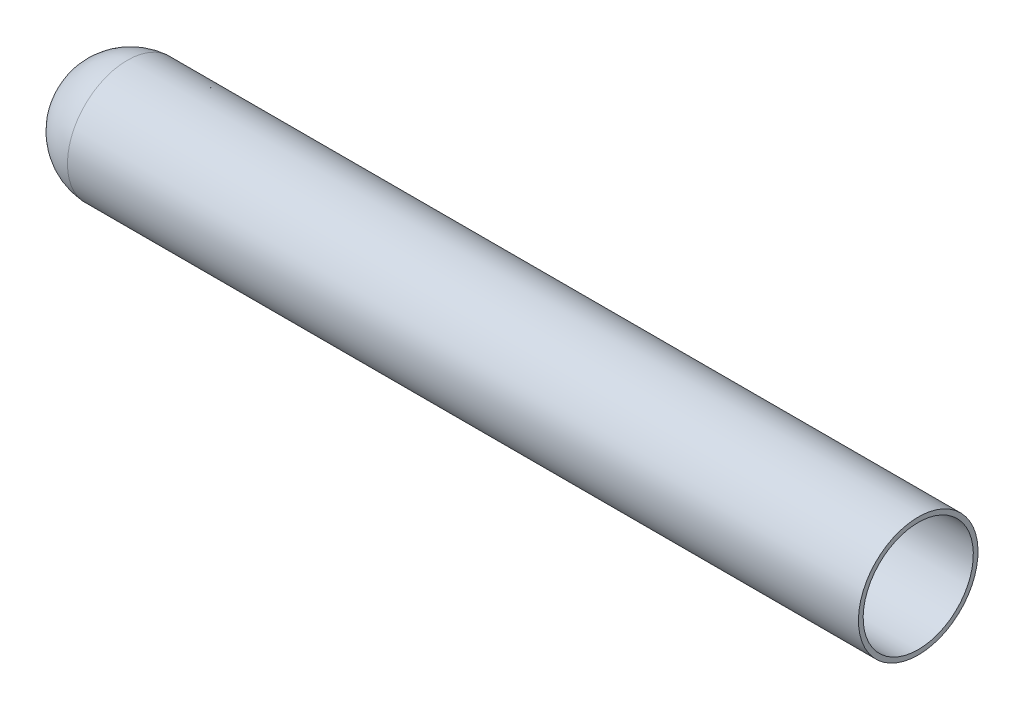
ISO-10303-21;
HEADER;
FILE_DESCRIPTION(('STEP AP214'),'2;1');
FILE_NAME('part.step','',(''),(''),'','','');
FILE_SCHEMA(('AUTOMOTIVE_DESIGN { 1 0 10303 214 1 1 1 1 }'));
ENDSEC;
DATA;
#1=APPLICATION_CONTEXT('core data for automotive mechanical design processes');
#2=APPLICATION_PROTOCOL_DEFINITION('international standard','automotive_design',2000,#1);
#3=PRODUCT_CONTEXT('',#1,'mechanical');
#4=PRODUCT('Part','Part','',(#3));
#5=PRODUCT_RELATED_PRODUCT_CATEGORY('part','',(#4));
#6=PRODUCT_DEFINITION_FORMATION('','',#4);
#7=PRODUCT_DEFINITION_CONTEXT('part definition',#1,'design');
#8=PRODUCT_DEFINITION('design','',#6,#7);
#9=PRODUCT_DEFINITION_SHAPE('','',#8);
#10=(LENGTH_UNIT() NAMED_UNIT(*) SI_UNIT(.MILLI.,.METRE.));
#11=(NAMED_UNIT(*) PLANE_ANGLE_UNIT() SI_UNIT($,.RADIAN.));
#12=(NAMED_UNIT(*) SI_UNIT($,.STERADIAN.) SOLID_ANGLE_UNIT());
#13=UNCERTAINTY_MEASURE_WITH_UNIT(LENGTH_MEASURE(1.E-05),#10,'distance_accuracy_value','');
#14=(GEOMETRIC_REPRESENTATION_CONTEXT(3) GLOBAL_UNCERTAINTY_ASSIGNED_CONTEXT((#13)) GLOBAL_UNIT_ASSIGNED_CONTEXT((#10,
#11,#12)) REPRESENTATION_CONTEXT('',''));
#15=CARTESIAN_POINT('',(0.,0.,0.));
#16=DIRECTION('',(0.,0.,1.));
#17=DIRECTION('',(1.,0.,0.));
#18=AXIS2_PLACEMENT_3D('',#15,#16,#17);
#19=CARTESIAN_POINT('',(3.18010416666666,0.,0.));
#20=DIRECTION('',(-1.,0.,0.));
#21=DIRECTION('',(0.,1.,0.));
#22=AXIS2_PLACEMENT_3D('',#19,#20,#21);
#23=SPHERICAL_SURFACE('',#22,3.18010416666666);
#24=CARTESIAN_POINT('',(3.,0.,0.));
#25=DIRECTION('',(-1.,0.,0.));
#26=DIRECTION('',(0.,-1.,0.));
#27=AXIS2_PLACEMENT_3D('',#24,#25,#26);
#28=CIRCLE('',#27,3.17499999999999);
#29=CARTESIAN_POINT('',(3.,-3.17499999999999,0.));
#30=VERTEX_POINT('',#29);
#31=EDGE_CURVE('E54',#30,#30,#28,.T.);
#32=ORIENTED_EDGE('',*,*,#31,.T.);
#33=EDGE_LOOP('',(#32));
#34=FACE_BOUND('',#33,.T.);
#35=ADVANCED_FACE('F37',(#34),#23,.T.);
#36=CARTESIAN_POINT('',(3.18010416666666,0.,0.));
#37=DIRECTION('',(-1.,0.,0.));
#38=DIRECTION('',(0.,1.,0.));
#39=AXIS2_PLACEMENT_3D('',#36,#37,#38);
#40=SPHERICAL_SURFACE('',#39,2.93010416666666);
#41=CARTESIAN_POINT('',(3.0072301445657,0.,0.));
#42=DIRECTION('',(-1.,0.,0.));
#43=DIRECTION('',(0.,-1.,0.));
#44=AXIS2_PLACEMENT_3D('',#41,#42,#43);
#45=CIRCLE('',#44,2.92499999999999);
#46=CARTESIAN_POINT('',(3.0072301445657,-2.92499999999999,0.));
#47=VERTEX_POINT('',#46);
#48=EDGE_CURVE('E10',#47,#47,#45,.T.);
#49=ORIENTED_EDGE('',*,*,#48,.F.);
#50=EDGE_LOOP('',(#49));
#51=FACE_BOUND('',#50,.T.);
#52=ADVANCED_FACE('F75',(#51),#40,.F.);
#53=CARTESIAN_POINT('',(0.25,0.,0.));
#54=DIRECTION('',(-1.,0.,0.));
#55=DIRECTION('',(0.,-1.,0.));
#56=AXIS2_PLACEMENT_3D('',#53,#54,#55);
#57=CYLINDRICAL_SURFACE('',#56,2.925);
#58=CARTESIAN_POINT('',(45.,0.,0.));
#59=DIRECTION('',(-1.,0.,0.));
#60=DIRECTION('',(0.,-1.,0.));
#61=AXIS2_PLACEMENT_3D('',#58,#59,#60);
#62=CIRCLE('',#61,2.925);
#63=CARTESIAN_POINT('',(45.,-2.925,0.));
#64=VERTEX_POINT('',#63);
#65=EDGE_CURVE('E44',#64,#64,#62,.T.);
#66=ORIENTED_EDGE('',*,*,#65,.F.);
#67=EDGE_LOOP('',(#66));
#68=FACE_BOUND('',#67,.T.);
#69=ORIENTED_EDGE('',*,*,#48,.T.);
#70=EDGE_LOOP('',(#69));
#71=FACE_BOUND('',#70,.T.);
#72=ADVANCED_FACE('F70',(#68,#71),#57,.F.);
#73=CARTESIAN_POINT('',(45.,2.925,0.));
#74=DIRECTION('',(-1.,0.,0.));
#75=DIRECTION('',(0.,-1.,0.));
#76=AXIS2_PLACEMENT_3D('',#73,#74,#75);
#77=PLANE('',#76);
#78=CARTESIAN_POINT('',(45.,0.,0.));
#79=DIRECTION('',(-1.,0.,0.));
#80=DIRECTION('',(0.,-1.,0.));
#81=AXIS2_PLACEMENT_3D('',#78,#79,#80);
#82=CIRCLE('',#81,3.175);
#83=CARTESIAN_POINT('',(45.,-3.175,0.));
#84=VERTEX_POINT('',#83);
#85=EDGE_CURVE('E49',#84,#84,#82,.T.);
#86=ORIENTED_EDGE('',*,*,#85,.F.);
#87=EDGE_LOOP('',(#86));
#88=FACE_BOUND('',#87,.T.);
#89=ORIENTED_EDGE('',*,*,#65,.T.);
#90=EDGE_LOOP('',(#89));
#91=FACE_BOUND('',#90,.T.);
#92=ADVANCED_FACE('F65',(#88,#91),#77,.F.);
#93=CARTESIAN_POINT('',(0.25,0.,0.));
#94=DIRECTION('',(-1.,0.,0.));
#95=DIRECTION('',(0.,-1.,0.));
#96=AXIS2_PLACEMENT_3D('',#93,#94,#95);
#97=CYLINDRICAL_SURFACE('',#96,3.175);
#98=ORIENTED_EDGE('',*,*,#31,.F.);
#99=EDGE_LOOP('',(#98));
#100=FACE_BOUND('',#99,.T.);
#101=ORIENTED_EDGE('',*,*,#85,.T.);
#102=EDGE_LOOP('',(#101));
#103=FACE_BOUND('',#102,.T.);
#104=ADVANCED_FACE('F62',(#100,#103),#97,.T.);
#105=CLOSED_SHELL('',(#35,#52,#72,#92,#104));
#106=MANIFOLD_SOLID_BREP('B2',#105);
#107=ADVANCED_BREP_SHAPE_REPRESENTATION('',(#18,#106),#14);
#108=SHAPE_DEFINITION_REPRESENTATION(#9,#107);
ENDSEC;
END-ISO-10303-21;
